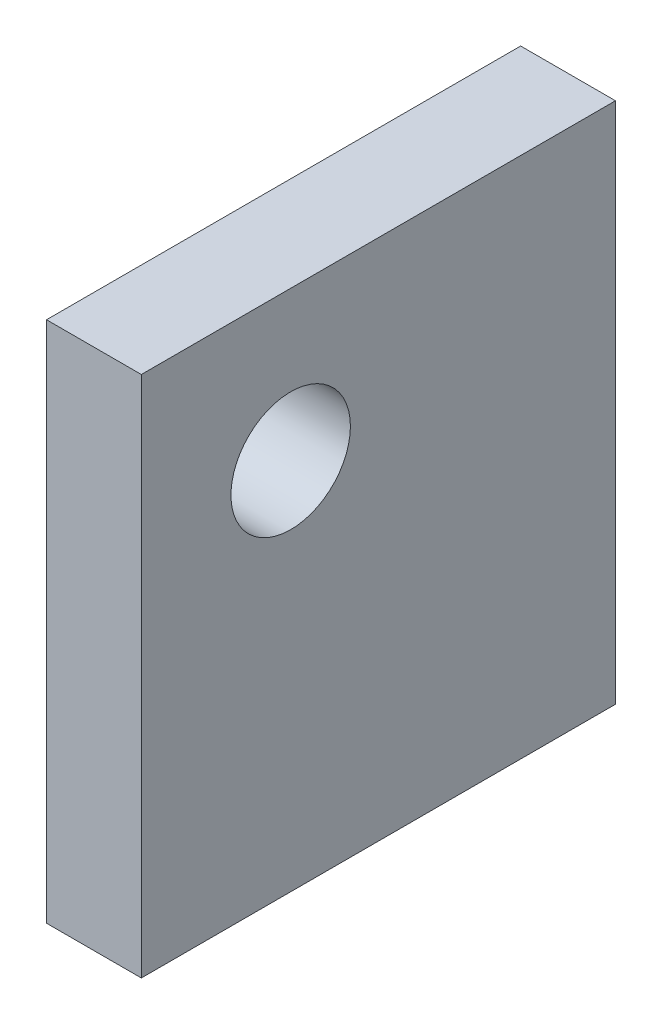
ISO-10303-21;
HEADER;
FILE_DESCRIPTION(('STEP AP214'),'2;1');
FILE_NAME('part.step','',(''),(''),'','','');
FILE_SCHEMA(('AUTOMOTIVE_DESIGN { 1 0 10303 214 1 1 1 1 }'));
ENDSEC;
DATA;
#1=APPLICATION_CONTEXT('core data for automotive mechanical design processes');
#2=APPLICATION_PROTOCOL_DEFINITION('international standard','automotive_design',2000,#1);
#3=PRODUCT_CONTEXT('',#1,'mechanical');
#4=PRODUCT('Part','Part','',(#3));
#5=PRODUCT_RELATED_PRODUCT_CATEGORY('part','',(#4));
#6=PRODUCT_DEFINITION_FORMATION('','',#4);
#7=PRODUCT_DEFINITION_CONTEXT('part definition',#1,'design');
#8=PRODUCT_DEFINITION('design','',#6,#7);
#9=PRODUCT_DEFINITION_SHAPE('','',#8);
#10=(LENGTH_UNIT() NAMED_UNIT(*) SI_UNIT(.MILLI.,.METRE.));
#11=(NAMED_UNIT(*) PLANE_ANGLE_UNIT() SI_UNIT($,.RADIAN.));
#12=(NAMED_UNIT(*) SI_UNIT($,.STERADIAN.) SOLID_ANGLE_UNIT());
#13=UNCERTAINTY_MEASURE_WITH_UNIT(LENGTH_MEASURE(1.E-05),#10,'distance_accuracy_value','');
#14=(GEOMETRIC_REPRESENTATION_CONTEXT(3) GLOBAL_UNCERTAINTY_ASSIGNED_CONTEXT((#13)) GLOBAL_UNIT_ASSIGNED_CONTEXT((#10,
#11,#12)) REPRESENTATION_CONTEXT('',''));
#15=CARTESIAN_POINT('',(0.,0.,0.));
#16=DIRECTION('',(0.,0.,1.));
#17=DIRECTION('',(1.,0.,0.));
#18=AXIS2_PLACEMENT_3D('',#15,#16,#17);
#19=CARTESIAN_POINT('',(0.,140.,0.));
#20=DIRECTION('',(1.,0.,0.));
#21=DIRECTION('',(0.,0.,-1.));
#22=AXIS2_PLACEMENT_3D('',#19,#20,#21);
#23=PLANE('',#22);
#24=CARTESIAN_POINT('',(0.,100.,-40.));
#25=DIRECTION('',(1.,0.,0.));
#26=DIRECTION('',(0.,0.,-1.));
#27=AXIS2_PLACEMENT_3D('',#24,#25,#26);
#28=CIRCLE('',#27,16.);
#29=CARTESIAN_POINT('',(0.,100.,-56.));
#30=VERTEX_POINT('',#29);
#31=EDGE_CURVE('E97',#30,#30,#28,.T.);
#32=ORIENTED_EDGE('',*,*,#31,.T.);
#33=EDGE_LOOP('',(#32));
#34=FACE_BOUND('',#33,.T.);
#35=DIRECTION('',(0.,0.,1.));
#36=VECTOR('',#35,1.);
#37=CARTESIAN_POINT('',(0.,0.,0.));
#38=LINE('',#37,#36);
#39=CARTESIAN_POINT('',(0.,0.,-127.));
#40=VERTEX_POINT('',#39);
#41=CARTESIAN_POINT('',(0.,0.,0.));
#42=VERTEX_POINT('',#41);
#43=EDGE_CURVE('E94',#40,#42,#38,.T.);
#44=ORIENTED_EDGE('',*,*,#43,.T.);
#45=DIRECTION('',(0.,-1.,0.));
#46=VECTOR('',#45,1.);
#47=CARTESIAN_POINT('',(0.,140.,0.));
#48=LINE('',#47,#46);
#49=CARTESIAN_POINT('',(0.,140.,0.));
#50=VERTEX_POINT('',#49);
#51=EDGE_CURVE('E11',#50,#42,#48,.T.);
#52=ORIENTED_EDGE('',*,*,#51,.F.);
#53=DIRECTION('',(0.,0.,1.));
#54=VECTOR('',#53,1.);
#55=CARTESIAN_POINT('',(0.,140.,0.));
#56=LINE('',#55,#54);
#57=CARTESIAN_POINT('',(0.,140.,-127.));
#58=VERTEX_POINT('',#57);
#59=EDGE_CURVE('E82',#58,#50,#56,.T.);
#60=ORIENTED_EDGE('',*,*,#59,.F.);
#61=DIRECTION('',(0.,-1.,0.));
#62=VECTOR('',#61,1.);
#63=CARTESIAN_POINT('',(0.,140.,-127.));
#64=LINE('',#63,#62);
#65=EDGE_CURVE('E90',#58,#40,#64,.T.);
#66=ORIENTED_EDGE('',*,*,#65,.T.);
#67=EDGE_LOOP('',(#44,#52,#60,#66));
#68=FACE_BOUND('',#67,.T.);
#69=ADVANCED_FACE('F31',(#34,#68),#23,.F.);
#70=CARTESIAN_POINT('',(0.,140.,0.));
#71=DIRECTION('',(0.,0.,-1.));
#72=DIRECTION('',(-1.,0.,0.));
#73=AXIS2_PLACEMENT_3D('',#70,#71,#72);
#74=PLANE('',#73);
#75=DIRECTION('',(1.,0.,0.));
#76=VECTOR('',#75,1.);
#77=CARTESIAN_POINT('',(0.,0.,0.));
#78=LINE('',#77,#76);
#79=CARTESIAN_POINT('',(25.4,0.,0.));
#80=VERTEX_POINT('',#79);
#81=EDGE_CURVE('E86',#42,#80,#78,.T.);
#82=ORIENTED_EDGE('',*,*,#81,.T.);
#83=DIRECTION('',(0.,-1.,0.));
#84=VECTOR('',#83,1.);
#85=CARTESIAN_POINT('',(25.4,140.,0.));
#86=LINE('',#85,#84);
#87=CARTESIAN_POINT('',(25.4,140.,0.));
#88=VERTEX_POINT('',#87);
#89=EDGE_CURVE('E39',#88,#80,#86,.T.);
#90=ORIENTED_EDGE('',*,*,#89,.F.);
#91=DIRECTION('',(1.,0.,0.));
#92=VECTOR('',#91,1.);
#93=CARTESIAN_POINT('',(0.,140.,0.));
#94=LINE('',#93,#92);
#95=EDGE_CURVE('E77',#50,#88,#94,.T.);
#96=ORIENTED_EDGE('',*,*,#95,.F.);
#97=ORIENTED_EDGE('',*,*,#51,.T.);
#98=EDGE_LOOP('',(#82,#90,#96,#97));
#99=FACE_BOUND('',#98,.T.);
#100=ADVANCED_FACE('F85',(#99),#74,.F.);
#101=CARTESIAN_POINT('',(25.4,140.,0.));
#102=DIRECTION('',(-1.,0.,0.));
#103=DIRECTION('',(0.,0.,1.));
#104=AXIS2_PLACEMENT_3D('',#101,#102,#103);
#105=PLANE('',#104);
#106=CARTESIAN_POINT('',(25.4,100.,-40.));
#107=DIRECTION('',(1.,0.,0.));
#108=DIRECTION('',(0.,0.,-1.));
#109=AXIS2_PLACEMENT_3D('',#106,#107,#108);
#110=CIRCLE('',#109,16.);
#111=CARTESIAN_POINT('',(25.4,100.,-56.));
#112=VERTEX_POINT('',#111);
#113=EDGE_CURVE('E110',#112,#112,#110,.T.);
#114=ORIENTED_EDGE('',*,*,#113,.F.);
#115=EDGE_LOOP('',(#114));
#116=FACE_BOUND('',#115,.T.);
#117=DIRECTION('',(0.,0.,-1.));
#118=VECTOR('',#117,1.);
#119=CARTESIAN_POINT('',(25.4,0.,0.));
#120=LINE('',#119,#118);
#121=CARTESIAN_POINT('',(25.4,0.,-127.));
#122=VERTEX_POINT('',#121);
#123=EDGE_CURVE('E64',#80,#122,#120,.T.);
#124=ORIENTED_EDGE('',*,*,#123,.T.);
#125=DIRECTION('',(0.,-1.,0.));
#126=VECTOR('',#125,1.);
#127=CARTESIAN_POINT('',(25.4,140.,-127.));
#128=LINE('',#127,#126);
#129=CARTESIAN_POINT('',(25.4,140.,-127.));
#130=VERTEX_POINT('',#129);
#131=EDGE_CURVE('E87',#130,#122,#128,.T.);
#132=ORIENTED_EDGE('',*,*,#131,.F.);
#133=DIRECTION('',(0.,0.,-1.));
#134=VECTOR('',#133,1.);
#135=CARTESIAN_POINT('',(25.4,140.,0.));
#136=LINE('',#135,#134);
#137=EDGE_CURVE('E80',#88,#130,#136,.T.);
#138=ORIENTED_EDGE('',*,*,#137,.F.);
#139=ORIENTED_EDGE('',*,*,#89,.T.);
#140=EDGE_LOOP('',(#124,#132,#138,#139));
#141=FACE_BOUND('',#140,.T.);
#142=ADVANCED_FACE('F88',(#116,#141),#105,.F.);
#143=CARTESIAN_POINT('',(0.,140.,-127.));
#144=DIRECTION('',(0.,0.,1.));
#145=DIRECTION('',(1.,0.,0.));
#146=AXIS2_PLACEMENT_3D('',#143,#144,#145);
#147=PLANE('',#146);
#148=DIRECTION('',(-1.,0.,0.));
#149=VECTOR('',#148,1.);
#150=CARTESIAN_POINT('',(0.,0.,-127.));
#151=LINE('',#150,#149);
#152=EDGE_CURVE('E70',#122,#40,#151,.T.);
#153=ORIENTED_EDGE('',*,*,#152,.T.);
#154=ORIENTED_EDGE('',*,*,#65,.F.);
#155=DIRECTION('',(-1.,0.,0.));
#156=VECTOR('',#155,1.);
#157=CARTESIAN_POINT('',(0.,140.,-127.));
#158=LINE('',#157,#156);
#159=EDGE_CURVE('E47',#130,#58,#158,.T.);
#160=ORIENTED_EDGE('',*,*,#159,.F.);
#161=ORIENTED_EDGE('',*,*,#131,.T.);
#162=EDGE_LOOP('',(#153,#154,#160,#161));
#163=FACE_BOUND('',#162,.T.);
#164=ADVANCED_FACE('F102',(#163),#147,.F.);
#165=CARTESIAN_POINT('',(0.,140.,-127.));
#166=DIRECTION('',(0.,-1.,0.));
#167=DIRECTION('',(0.,0.,-1.));
#168=AXIS2_PLACEMENT_3D('',#165,#166,#167);
#169=PLANE('',#168);
#170=ORIENTED_EDGE('',*,*,#59,.T.);
#171=ORIENTED_EDGE('',*,*,#95,.T.);
#172=ORIENTED_EDGE('',*,*,#137,.T.);
#173=ORIENTED_EDGE('',*,*,#159,.T.);
#174=EDGE_LOOP('',(#170,#171,#172,#173));
#175=FACE_BOUND('',#174,.T.);
#176=ADVANCED_FACE('F78',(#175),#169,.F.);
#177=CARTESIAN_POINT('',(0.,0.,-127.));
#178=DIRECTION('',(0.,-1.,0.));
#179=DIRECTION('',(0.,0.,-1.));
#180=AXIS2_PLACEMENT_3D('',#177,#178,#179);
#181=PLANE('',#180);
#182=ORIENTED_EDGE('',*,*,#43,.F.);
#183=ORIENTED_EDGE('',*,*,#152,.F.);
#184=ORIENTED_EDGE('',*,*,#123,.F.);
#185=ORIENTED_EDGE('',*,*,#81,.F.);
#186=EDGE_LOOP('',(#182,#183,#184,#185));
#187=FACE_BOUND('',#186,.T.);
#188=ADVANCED_FACE('F105',(#187),#181,.T.);
#189=CARTESIAN_POINT('',(-474.6,100.,-40.));
#190=DIRECTION('',(1.,0.,0.));
#191=DIRECTION('',(0.,0.,-1.));
#192=AXIS2_PLACEMENT_3D('',#189,#190,#191);
#193=CYLINDRICAL_SURFACE('',#192,16.);
#194=ORIENTED_EDGE('',*,*,#113,.T.);
#195=EDGE_LOOP('',(#194));
#196=FACE_BOUND('',#195,.T.);
#197=ORIENTED_EDGE('',*,*,#31,.F.);
#198=EDGE_LOOP('',(#197));
#199=FACE_BOUND('',#198,.T.);
#200=ADVANCED_FACE('F114',(#196,#199),#193,.F.);
#201=CLOSED_SHELL('',(#69,#100,#142,#164,#176,#188,#200));
#202=MANIFOLD_SOLID_BREP('B2',#201);
#203=ADVANCED_BREP_SHAPE_REPRESENTATION('',(#18,#202),#14);
#204=SHAPE_DEFINITION_REPRESENTATION(#9,#203);
ENDSEC;
END-ISO-10303-21;
